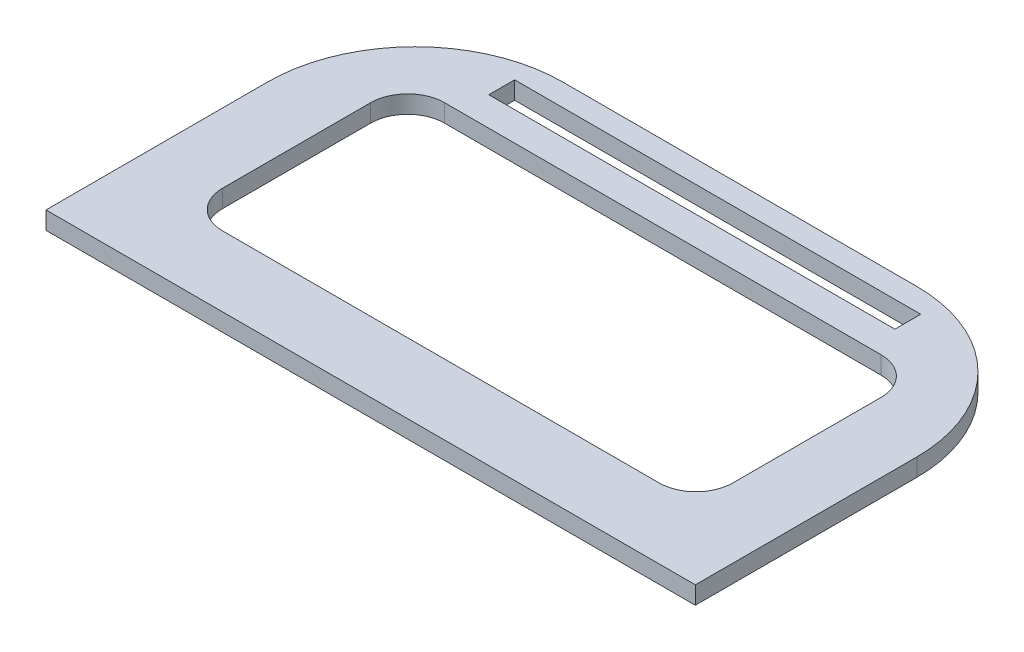
ISO-10303-21;
HEADER;
FILE_DESCRIPTION(('STEP AP214'),'2;1');
FILE_NAME('part.step','',(''),(''),'','','');
FILE_SCHEMA(('AUTOMOTIVE_DESIGN { 1 0 10303 214 1 1 1 1 }'));
ENDSEC;
DATA;
#1=APPLICATION_CONTEXT('core data for automotive mechanical design processes');
#2=APPLICATION_PROTOCOL_DEFINITION('international standard','automotive_design',2000,#1);
#3=PRODUCT_CONTEXT('',#1,'mechanical');
#4=PRODUCT('Part','Part','',(#3));
#5=PRODUCT_RELATED_PRODUCT_CATEGORY('part','',(#4));
#6=PRODUCT_DEFINITION_FORMATION('','',#4);
#7=PRODUCT_DEFINITION_CONTEXT('part definition',#1,'design');
#8=PRODUCT_DEFINITION('design','',#6,#7);
#9=PRODUCT_DEFINITION_SHAPE('','',#8);
#10=(LENGTH_UNIT() NAMED_UNIT(*) SI_UNIT(.MILLI.,.METRE.));
#11=(NAMED_UNIT(*) PLANE_ANGLE_UNIT() SI_UNIT($,.RADIAN.));
#12=(NAMED_UNIT(*) SI_UNIT($,.STERADIAN.) SOLID_ANGLE_UNIT());
#13=UNCERTAINTY_MEASURE_WITH_UNIT(LENGTH_MEASURE(1.E-05),#10,'distance_accuracy_value','');
#14=(GEOMETRIC_REPRESENTATION_CONTEXT(3) GLOBAL_UNCERTAINTY_ASSIGNED_CONTEXT((#13)) GLOBAL_UNIT_ASSIGNED_CONTEXT((#10,
#11,#12)) REPRESENTATION_CONTEXT('',''));
#15=CARTESIAN_POINT('',(0.,0.,0.));
#16=DIRECTION('',(0.,0.,1.));
#17=DIRECTION('',(1.,0.,0.));
#18=AXIS2_PLACEMENT_3D('',#15,#16,#17);
#19=CARTESIAN_POINT('',(0.,0.24,0.));
#20=DIRECTION('',(0.,-1.,0.));
#21=DIRECTION('',(0.,0.,-1.));
#22=AXIS2_PLACEMENT_3D('',#19,#20,#21);
#23=PLANE('',#22);
#24=DIRECTION('',(1.,0.,0.));
#25=VECTOR('',#24,1.);
#26=CARTESIAN_POINT('',(0.940876916961848,0.24,-0.949696404322964));
#27=LINE('',#26,#25);
#28=CARTESIAN_POINT('',(1.44087691696185,0.24,-0.949696404322964));
#29=VERTEX_POINT('',#28);
#30=CARTESIAN_POINT('',(7.35420939937131,0.24,-0.949696404322964));
#31=VERTEX_POINT('',#30);
#32=EDGE_CURVE('E372',#29,#31,#27,.T.);
#33=ORIENTED_EDGE('',*,*,#32,.F.);
#34=CARTESIAN_POINT('',(1.44087691696185,0.24,-1.44969640432296));
#35=DIRECTION('',(0.,-1.,0.));
#36=DIRECTION('',(0.,0.,-1.));
#37=AXIS2_PLACEMENT_3D('',#34,#35,#36);
#38=CIRCLE('',#37,0.5);
#39=CARTESIAN_POINT('',(0.940876916961848,0.24,-1.44969640432296));
#40=VERTEX_POINT('',#39);
#41=EDGE_CURVE('E49',#29,#40,#38,.T.);
#42=ORIENTED_EDGE('',*,*,#41,.T.);
#43=DIRECTION('',(0.,0.,1.));
#44=VECTOR('',#43,1.);
#45=CARTESIAN_POINT('',(0.940876916961848,0.24,-3.95690426450912));
#46=LINE('',#45,#44);
#47=CARTESIAN_POINT('',(0.940876916961848,0.24,-3.45690426450912));
#48=VERTEX_POINT('',#47);
#49=EDGE_CURVE('E370',#48,#40,#46,.T.);
#50=ORIENTED_EDGE('',*,*,#49,.F.);
#51=CARTESIAN_POINT('',(1.44087691696185,0.24,-3.45690426450912));
#52=DIRECTION('',(0.,-1.,0.));
#53=DIRECTION('',(0.,0.,-1.));
#54=AXIS2_PLACEMENT_3D('',#51,#52,#53);
#55=CIRCLE('',#54,0.5);
#56=CARTESIAN_POINT('',(1.44087691696185,0.24,-3.95690426450912));
#57=VERTEX_POINT('',#56);
#58=EDGE_CURVE('E361',#48,#57,#55,.T.);
#59=ORIENTED_EDGE('',*,*,#58,.T.);
#60=DIRECTION('',(-1.,0.,0.));
#61=VECTOR('',#60,1.);
#62=CARTESIAN_POINT('',(0.940876916961848,0.24,-3.95690426450912));
#63=LINE('',#62,#61);
#64=CARTESIAN_POINT('',(7.35420939937131,0.24,-3.95690426450912));
#65=VERTEX_POINT('',#64);
#66=EDGE_CURVE('E398',#65,#57,#63,.T.);
#67=ORIENTED_EDGE('',*,*,#66,.F.);
#68=CARTESIAN_POINT('',(7.35420939937131,0.24,-3.45690426450912));
#69=DIRECTION('',(0.,-1.,0.));
#70=DIRECTION('',(0.,0.,-1.));
#71=AXIS2_PLACEMENT_3D('',#68,#69,#70);
#72=CIRCLE('',#71,0.5);
#73=CARTESIAN_POINT('',(7.85420939937131,0.24,-3.45690426450912));
#74=VERTEX_POINT('',#73);
#75=EDGE_CURVE('E355',#65,#74,#72,.T.);
#76=ORIENTED_EDGE('',*,*,#75,.T.);
#77=DIRECTION('',(0.,0.,-1.));
#78=VECTOR('',#77,1.);
#79=CARTESIAN_POINT('',(7.85420939937131,0.24,-3.95690426450912));
#80=LINE('',#79,#78);
#81=CARTESIAN_POINT('',(7.85420939937131,0.24,-1.44969640432296));
#82=VERTEX_POINT('',#81);
#83=EDGE_CURVE('E404',#82,#74,#80,.T.);
#84=ORIENTED_EDGE('',*,*,#83,.F.);
#85=CARTESIAN_POINT('',(7.35420939937131,0.24,-1.44969640432296));
#86=DIRECTION('',(0.,-1.,0.));
#87=DIRECTION('',(0.,0.,-1.));
#88=AXIS2_PLACEMENT_3D('',#85,#86,#87);
#89=CIRCLE('',#88,0.5);
#90=EDGE_CURVE('E349',#82,#31,#89,.T.);
#91=ORIENTED_EDGE('',*,*,#90,.T.);
#92=EDGE_LOOP('',(#33,#42,#50,#59,#67,#76,#84,#91));
#93=FACE_BOUND('',#92,.T.);
#94=DIRECTION('',(0.,0.,-1.));
#95=VECTOR('',#94,1.);
#96=CARTESIAN_POINT('',(8.79508631633316,0.24,-5.));
#97=LINE('',#96,#95);
#98=CARTESIAN_POINT('',(8.79508631633316,0.24,0.));
#99=VERTEX_POINT('',#98);
#100=CARTESIAN_POINT('',(8.79508631633316,0.24,-3.));
#101=VERTEX_POINT('',#100);
#102=EDGE_CURVE('E264',#99,#101,#97,.T.);
#103=ORIENTED_EDGE('',*,*,#102,.T.);
#104=CARTESIAN_POINT('',(6.79508631633316,0.24,-3.));
#105=DIRECTION('',(0.,-1.,0.));
#106=DIRECTION('',(0.,0.,-1.));
#107=AXIS2_PLACEMENT_3D('',#104,#105,#106);
#108=CIRCLE('',#107,2.);
#109=CARTESIAN_POINT('',(6.79508631633316,0.24,-5.));
#110=VERTEX_POINT('',#109);
#111=EDGE_CURVE('E316',#101,#110,#108,.F.);
#112=ORIENTED_EDGE('',*,*,#111,.T.);
#113=DIRECTION('',(-1.,0.,0.));
#114=VECTOR('',#113,1.);
#115=CARTESIAN_POINT('',(0.,0.24,-5.));
#116=LINE('',#115,#114);
#117=CARTESIAN_POINT('',(2.,0.24,-5.));
#118=VERTEX_POINT('',#117);
#119=EDGE_CURVE('E269',#110,#118,#116,.T.);
#120=ORIENTED_EDGE('',*,*,#119,.T.);
#121=CARTESIAN_POINT('',(2.,0.24,-3.));
#122=DIRECTION('',(0.,-1.,0.));
#123=DIRECTION('',(0.,0.,-1.));
#124=AXIS2_PLACEMENT_3D('',#121,#122,#123);
#125=CIRCLE('',#124,2.);
#126=CARTESIAN_POINT('',(0.,0.24,-3.));
#127=VERTEX_POINT('',#126);
#128=EDGE_CURVE('E313',#118,#127,#125,.F.);
#129=ORIENTED_EDGE('',*,*,#128,.T.);
#130=DIRECTION('',(0.,0.,1.));
#131=VECTOR('',#130,1.);
#132=CARTESIAN_POINT('',(0.,0.24,0.));
#133=LINE('',#132,#131);
#134=CARTESIAN_POINT('',(0.,0.24,0.));
#135=VERTEX_POINT('',#134);
#136=EDGE_CURVE('E273',#127,#135,#133,.T.);
#137=ORIENTED_EDGE('',*,*,#136,.T.);
#138=DIRECTION('',(1.,0.,0.));
#139=VECTOR('',#138,1.);
#140=CARTESIAN_POINT('',(8.79508631633316,0.24,0.));
#141=LINE('',#140,#139);
#142=EDGE_CURVE('E260',#135,#99,#141,.T.);
#143=ORIENTED_EDGE('',*,*,#142,.T.);
#144=EDGE_LOOP('',(#103,#112,#120,#129,#137,#143));
#145=FACE_BOUND('',#144,.T.);
#146=DIRECTION('',(-1.,0.,0.));
#147=VECTOR('',#146,1.);
#148=CARTESIAN_POINT('',(7.14754315816658,0.24,-4.7));
#149=LINE('',#148,#147);
#150=CARTESIAN_POINT('',(7.14754315816658,0.24,-4.7));
#151=VERTEX_POINT('',#150);
#152=CARTESIAN_POINT('',(1.64754315816658,0.24,-4.7));
#153=VERTEX_POINT('',#152);
#154=EDGE_CURVE('E204',#151,#153,#149,.T.);
#155=ORIENTED_EDGE('',*,*,#154,.F.);
#156=DIRECTION('',(0.,0.,-1.));
#157=VECTOR('',#156,1.);
#158=CARTESIAN_POINT('',(7.14754315816658,0.24,-4.35));
#159=LINE('',#158,#157);
#160=CARTESIAN_POINT('',(7.14754315816658,0.24,-4.35));
#161=VERTEX_POINT('',#160);
#162=EDGE_CURVE('E235',#161,#151,#159,.T.);
#163=ORIENTED_EDGE('',*,*,#162,.F.);
#164=DIRECTION('',(1.,0.,0.));
#165=VECTOR('',#164,1.);
#166=CARTESIAN_POINT('',(1.64754315816658,0.24,-4.35));
#167=LINE('',#166,#165);
#168=CARTESIAN_POINT('',(1.64754315816658,0.24,-4.35));
#169=VERTEX_POINT('',#168);
#170=EDGE_CURVE('E229',#169,#161,#167,.T.);
#171=ORIENTED_EDGE('',*,*,#170,.F.);
#172=DIRECTION('',(0.,0.,1.));
#173=VECTOR('',#172,1.);
#174=CARTESIAN_POINT('',(1.64754315816658,0.24,-4.7));
#175=LINE('',#174,#173);
#176=EDGE_CURVE('E215',#153,#169,#175,.T.);
#177=ORIENTED_EDGE('',*,*,#176,.F.);
#178=EDGE_LOOP('',(#155,#163,#171,#177));
#179=FACE_BOUND('',#178,.T.);
#180=ADVANCED_FACE('F40',(#93,#145,#179),#23,.F.);
#181=CARTESIAN_POINT('',(0.,0.,0.));
#182=DIRECTION('',(0.,-1.,0.));
#183=DIRECTION('',(0.,0.,-1.));
#184=AXIS2_PLACEMENT_3D('',#181,#182,#183);
#185=PLANE('',#184);
#186=DIRECTION('',(-1.,0.,0.));
#187=VECTOR('',#186,1.);
#188=CARTESIAN_POINT('',(0.940876916961848,0.,-3.95690426450912));
#189=LINE('',#188,#187);
#190=CARTESIAN_POINT('',(7.35420939937131,0.,-3.95690426450912));
#191=VERTEX_POINT('',#190);
#192=CARTESIAN_POINT('',(1.44087691696185,0.,-3.95690426450912));
#193=VERTEX_POINT('',#192);
#194=EDGE_CURVE('E244',#191,#193,#189,.T.);
#195=ORIENTED_EDGE('',*,*,#194,.T.);
#196=CARTESIAN_POINT('',(1.44087691696185,0.,-3.45690426450912));
#197=DIRECTION('',(0.,-1.,0.));
#198=DIRECTION('',(0.,0.,-1.));
#199=AXIS2_PLACEMENT_3D('',#196,#197,#198);
#200=CIRCLE('',#199,0.5);
#201=CARTESIAN_POINT('',(0.940876916961848,0.,-3.45690426450912));
#202=VERTEX_POINT('',#201);
#203=EDGE_CURVE('E69',#193,#202,#200,.F.);
#204=ORIENTED_EDGE('',*,*,#203,.T.);
#205=DIRECTION('',(0.,0.,1.));
#206=VECTOR('',#205,1.);
#207=CARTESIAN_POINT('',(0.940876916961848,0.,-3.95690426450912));
#208=LINE('',#207,#206);
#209=CARTESIAN_POINT('',(0.940876916961848,0.,-1.44969640432296));
#210=VERTEX_POINT('',#209);
#211=EDGE_CURVE('E386',#202,#210,#208,.T.);
#212=ORIENTED_EDGE('',*,*,#211,.T.);
#213=CARTESIAN_POINT('',(1.44087691696185,0.,-1.44969640432296));
#214=DIRECTION('',(0.,-1.,0.));
#215=DIRECTION('',(0.,0.,-1.));
#216=AXIS2_PLACEMENT_3D('',#213,#214,#215);
#217=CIRCLE('',#216,0.5);
#218=CARTESIAN_POINT('',(1.44087691696185,0.,-0.949696404322964));
#219=VERTEX_POINT('',#218);
#220=EDGE_CURVE('E11',#210,#219,#217,.F.);
#221=ORIENTED_EDGE('',*,*,#220,.T.);
#222=DIRECTION('',(1.,0.,0.));
#223=VECTOR('',#222,1.);
#224=CARTESIAN_POINT('',(0.940876916961848,0.,-0.949696404322964));
#225=LINE('',#224,#223);
#226=CARTESIAN_POINT('',(7.35420939937131,0.,-0.949696404322964));
#227=VERTEX_POINT('',#226);
#228=EDGE_CURVE('E384',#219,#227,#225,.T.);
#229=ORIENTED_EDGE('',*,*,#228,.T.);
#230=CARTESIAN_POINT('',(7.35420939937131,0.,-1.44969640432296));
#231=DIRECTION('',(0.,-1.,0.));
#232=DIRECTION('',(0.,0.,-1.));
#233=AXIS2_PLACEMENT_3D('',#230,#231,#232);
#234=CIRCLE('',#233,0.5);
#235=CARTESIAN_POINT('',(7.85420939937131,0.,-1.44969640432296));
#236=VERTEX_POINT('',#235);
#237=EDGE_CURVE('E352',#227,#236,#234,.F.);
#238=ORIENTED_EDGE('',*,*,#237,.T.);
#239=DIRECTION('',(0.,0.,-1.));
#240=VECTOR('',#239,1.);
#241=CARTESIAN_POINT('',(7.85420939937131,0.,-3.95690426450912));
#242=LINE('',#241,#240);
#243=CARTESIAN_POINT('',(7.85420939937131,0.,-3.45690426450912));
#244=VERTEX_POINT('',#243);
#245=EDGE_CURVE('E391',#236,#244,#242,.T.);
#246=ORIENTED_EDGE('',*,*,#245,.T.);
#247=CARTESIAN_POINT('',(7.35420939937131,0.,-3.45690426450912));
#248=DIRECTION('',(0.,-1.,0.));
#249=DIRECTION('',(0.,0.,-1.));
#250=AXIS2_PLACEMENT_3D('',#247,#248,#249);
#251=CIRCLE('',#250,0.5);
#252=EDGE_CURVE('E358',#244,#191,#251,.F.);
#253=ORIENTED_EDGE('',*,*,#252,.T.);
#254=EDGE_LOOP('',(#195,#204,#212,#221,#229,#238,#246,#253));
#255=FACE_BOUND('',#254,.T.);
#256=DIRECTION('',(-1.,0.,0.));
#257=VECTOR('',#256,1.);
#258=CARTESIAN_POINT('',(0.,0.,-5.));
#259=LINE('',#258,#257);
#260=CARTESIAN_POINT('',(6.79508631633316,0.,-5.));
#261=VERTEX_POINT('',#260);
#262=CARTESIAN_POINT('',(2.,0.,-5.));
#263=VERTEX_POINT('',#262);
#264=EDGE_CURVE('E284',#261,#263,#259,.T.);
#265=ORIENTED_EDGE('',*,*,#264,.F.);
#266=CARTESIAN_POINT('',(6.79508631633316,0.,-3.));
#267=DIRECTION('',(0.,-1.,0.));
#268=DIRECTION('',(0.,0.,-1.));
#269=AXIS2_PLACEMENT_3D('',#266,#267,#268);
#270=CIRCLE('',#269,2.);
#271=CARTESIAN_POINT('',(8.79508631633316,0.,-3.));
#272=VERTEX_POINT('',#271);
#273=EDGE_CURVE('E307',#261,#272,#270,.T.);
#274=ORIENTED_EDGE('',*,*,#273,.T.);
#275=DIRECTION('',(0.,0.,-1.));
#276=VECTOR('',#275,1.);
#277=CARTESIAN_POINT('',(8.79508631633316,0.,-5.));
#278=LINE('',#277,#276);
#279=CARTESIAN_POINT('',(8.79508631633316,0.,0.));
#280=VERTEX_POINT('',#279);
#281=EDGE_CURVE('E280',#280,#272,#278,.T.);
#282=ORIENTED_EDGE('',*,*,#281,.F.);
#283=DIRECTION('',(1.,0.,0.));
#284=VECTOR('',#283,1.);
#285=CARTESIAN_POINT('',(8.79508631633316,0.,0.));
#286=LINE('',#285,#284);
#287=CARTESIAN_POINT('',(0.,0.,0.));
#288=VERTEX_POINT('',#287);
#289=EDGE_CURVE('E224',#288,#280,#286,.T.);
#290=ORIENTED_EDGE('',*,*,#289,.F.);
#291=DIRECTION('',(0.,0.,1.));
#292=VECTOR('',#291,1.);
#293=CARTESIAN_POINT('',(0.,0.,0.));
#294=LINE('',#293,#292);
#295=CARTESIAN_POINT('',(0.,0.,-3.));
#296=VERTEX_POINT('',#295);
#297=EDGE_CURVE('E265',#296,#288,#294,.T.);
#298=ORIENTED_EDGE('',*,*,#297,.F.);
#299=CARTESIAN_POINT('',(2.,0.,-3.));
#300=DIRECTION('',(0.,-1.,0.));
#301=DIRECTION('',(0.,0.,-1.));
#302=AXIS2_PLACEMENT_3D('',#299,#300,#301);
#303=CIRCLE('',#302,2.);
#304=EDGE_CURVE('E304',#296,#263,#303,.T.);
#305=ORIENTED_EDGE('',*,*,#304,.T.);
#306=EDGE_LOOP('',(#265,#274,#282,#290,#298,#305));
#307=FACE_BOUND('',#306,.T.);
#308=DIRECTION('',(0.,0.,-1.));
#309=VECTOR('',#308,1.);
#310=CARTESIAN_POINT('',(7.14754315816658,0.,-4.35));
#311=LINE('',#310,#309);
#312=CARTESIAN_POINT('',(7.14754315816658,0.,-4.35));
#313=VERTEX_POINT('',#312);
#314=CARTESIAN_POINT('',(7.14754315816658,0.,-4.7));
#315=VERTEX_POINT('',#314);
#316=EDGE_CURVE('E216',#313,#315,#311,.T.);
#317=ORIENTED_EDGE('',*,*,#316,.T.);
#318=DIRECTION('',(-1.,0.,0.));
#319=VECTOR('',#318,1.);
#320=CARTESIAN_POINT('',(7.14754315816658,0.,-4.7));
#321=LINE('',#320,#319);
#322=CARTESIAN_POINT('',(1.64754315816658,0.,-4.7));
#323=VERTEX_POINT('',#322);
#324=EDGE_CURVE('E241',#315,#323,#321,.T.);
#325=ORIENTED_EDGE('',*,*,#324,.T.);
#326=DIRECTION('',(0.,0.,1.));
#327=VECTOR('',#326,1.);
#328=CARTESIAN_POINT('',(1.64754315816658,0.,-4.7));
#329=LINE('',#328,#327);
#330=CARTESIAN_POINT('',(1.64754315816658,0.,-4.35));
#331=VERTEX_POINT('',#330);
#332=EDGE_CURVE('E222',#323,#331,#329,.T.);
#333=ORIENTED_EDGE('',*,*,#332,.T.);
#334=DIRECTION('',(1.,0.,0.));
#335=VECTOR('',#334,1.);
#336=CARTESIAN_POINT('',(1.64754315816658,0.,-4.35));
#337=LINE('',#336,#335);
#338=EDGE_CURVE('E246',#331,#313,#337,.T.);
#339=ORIENTED_EDGE('',*,*,#338,.T.);
#340=EDGE_LOOP('',(#317,#325,#333,#339));
#341=FACE_BOUND('',#340,.T.);
#342=ADVANCED_FACE('F382',(#255,#307,#341),#185,.T.);
#343=CARTESIAN_POINT('',(8.79508631633316,0.24,0.));
#344=DIRECTION('',(0.,0.,-1.));
#345=DIRECTION('',(-1.,0.,0.));
#346=AXIS2_PLACEMENT_3D('',#343,#344,#345);
#347=PLANE('',#346);
#348=ORIENTED_EDGE('',*,*,#289,.T.);
#349=DIRECTION('',(0.,-1.,0.));
#350=VECTOR('',#349,1.);
#351=CARTESIAN_POINT('',(8.79508631633316,0.24,0.));
#352=LINE('',#351,#350);
#353=EDGE_CURVE('E293',#99,#280,#352,.T.);
#354=ORIENTED_EDGE('',*,*,#353,.F.);
#355=ORIENTED_EDGE('',*,*,#142,.F.);
#356=DIRECTION('',(0.,-1.,0.));
#357=VECTOR('',#356,1.);
#358=CARTESIAN_POINT('',(0.,0.24,0.));
#359=LINE('',#358,#357);
#360=EDGE_CURVE('E276',#135,#288,#359,.T.);
#361=ORIENTED_EDGE('',*,*,#360,.T.);
#362=EDGE_LOOP('',(#348,#354,#355,#361));
#363=FACE_BOUND('',#362,.T.);
#364=ADVANCED_FACE('F431',(#363),#347,.F.);
#365=CARTESIAN_POINT('',(8.79508631633316,0.24,-5.));
#366=DIRECTION('',(-1.,0.,0.));
#367=DIRECTION('',(0.,0.,1.));
#368=AXIS2_PLACEMENT_3D('',#365,#366,#367);
#369=PLANE('',#368);
#370=ORIENTED_EDGE('',*,*,#281,.T.);
#371=DIRECTION('',(0.,-1.,0.));
#372=VECTOR('',#371,1.);
#373=CARTESIAN_POINT('',(8.79508631633316,0.24,-3.));
#374=LINE('',#373,#372);
#375=EDGE_CURVE('E310',#272,#101,#374,.F.);
#376=ORIENTED_EDGE('',*,*,#375,.T.);
#377=ORIENTED_EDGE('',*,*,#102,.F.);
#378=ORIENTED_EDGE('',*,*,#353,.T.);
#379=EDGE_LOOP('',(#370,#376,#377,#378));
#380=FACE_BOUND('',#379,.T.);
#381=ADVANCED_FACE('F443',(#380),#369,.F.);
#382=CARTESIAN_POINT('',(0.,0.24,-5.));
#383=DIRECTION('',(0.,0.,1.));
#384=DIRECTION('',(1.,0.,0.));
#385=AXIS2_PLACEMENT_3D('',#382,#383,#384);
#386=PLANE('',#385);
#387=ORIENTED_EDGE('',*,*,#119,.F.);
#388=DIRECTION('',(0.,-1.,0.));
#389=VECTOR('',#388,1.);
#390=CARTESIAN_POINT('',(6.79508631633316,0.24,-5.));
#391=LINE('',#390,#389);
#392=EDGE_CURVE('E300',#110,#261,#391,.T.);
#393=ORIENTED_EDGE('',*,*,#392,.T.);
#394=ORIENTED_EDGE('',*,*,#264,.T.);
#395=DIRECTION('',(0.,-1.,0.));
#396=VECTOR('',#395,1.);
#397=CARTESIAN_POINT('',(2.,0.24,-5.));
#398=LINE('',#397,#396);
#399=EDGE_CURVE('E297',#263,#118,#398,.F.);
#400=ORIENTED_EDGE('',*,*,#399,.T.);
#401=EDGE_LOOP('',(#387,#393,#394,#400));
#402=FACE_BOUND('',#401,.T.);
#403=ADVANCED_FACE('F439',(#402),#386,.F.);
#404=CARTESIAN_POINT('',(0.,0.24,0.));
#405=DIRECTION('',(1.,0.,0.));
#406=DIRECTION('',(0.,0.,-1.));
#407=AXIS2_PLACEMENT_3D('',#404,#405,#406);
#408=PLANE('',#407);
#409=ORIENTED_EDGE('',*,*,#136,.F.);
#410=DIRECTION('',(0.,-1.,0.));
#411=VECTOR('',#410,1.);
#412=CARTESIAN_POINT('',(0.,0.24,-3.));
#413=LINE('',#412,#411);
#414=EDGE_CURVE('E319',#127,#296,#413,.T.);
#415=ORIENTED_EDGE('',*,*,#414,.T.);
#416=ORIENTED_EDGE('',*,*,#297,.T.);
#417=ORIENTED_EDGE('',*,*,#360,.F.);
#418=EDGE_LOOP('',(#409,#415,#416,#417));
#419=FACE_BOUND('',#418,.T.);
#420=ADVANCED_FACE('F436',(#419),#408,.F.);
#421=CARTESIAN_POINT('',(7.14754315816658,0.24,-4.7));
#422=DIRECTION('',(0.,0.,1.));
#423=DIRECTION('',(1.,0.,0.));
#424=AXIS2_PLACEMENT_3D('',#421,#422,#423);
#425=PLANE('',#424);
#426=ORIENTED_EDGE('',*,*,#324,.F.);
#427=DIRECTION('',(0.,-1.,0.));
#428=VECTOR('',#427,1.);
#429=CARTESIAN_POINT('',(7.14754315816658,0.24,-4.7));
#430=LINE('',#429,#428);
#431=EDGE_CURVE('E210',#151,#315,#430,.T.);
#432=ORIENTED_EDGE('',*,*,#431,.F.);
#433=ORIENTED_EDGE('',*,*,#154,.T.);
#434=DIRECTION('',(0.,-1.,0.));
#435=VECTOR('',#434,1.);
#436=CARTESIAN_POINT('',(1.64754315816658,0.24,-4.7));
#437=LINE('',#436,#435);
#438=EDGE_CURVE('E207',#153,#323,#437,.T.);
#439=ORIENTED_EDGE('',*,*,#438,.T.);
#440=EDGE_LOOP('',(#426,#432,#433,#439));
#441=FACE_BOUND('',#440,.T.);
#442=ADVANCED_FACE('F206',(#441),#425,.T.);
#443=CARTESIAN_POINT('',(1.64754315816658,0.24,-4.7));
#444=DIRECTION('',(1.,0.,0.));
#445=DIRECTION('',(0.,0.,-1.));
#446=AXIS2_PLACEMENT_3D('',#443,#444,#445);
#447=PLANE('',#446);
#448=ORIENTED_EDGE('',*,*,#332,.F.);
#449=ORIENTED_EDGE('',*,*,#438,.F.);
#450=ORIENTED_EDGE('',*,*,#176,.T.);
#451=DIRECTION('',(0.,-1.,0.));
#452=VECTOR('',#451,1.);
#453=CARTESIAN_POINT('',(1.64754315816658,0.24,-4.35));
#454=LINE('',#453,#452);
#455=EDGE_CURVE('E225',#169,#331,#454,.T.);
#456=ORIENTED_EDGE('',*,*,#455,.T.);
#457=EDGE_LOOP('',(#448,#449,#450,#456));
#458=FACE_BOUND('',#457,.T.);
#459=ADVANCED_FACE('F219',(#458),#447,.T.);
#460=CARTESIAN_POINT('',(1.64754315816658,0.24,-4.35));
#461=DIRECTION('',(0.,0.,-1.));
#462=DIRECTION('',(-1.,0.,0.));
#463=AXIS2_PLACEMENT_3D('',#460,#461,#462);
#464=PLANE('',#463);
#465=ORIENTED_EDGE('',*,*,#338,.F.);
#466=ORIENTED_EDGE('',*,*,#455,.F.);
#467=ORIENTED_EDGE('',*,*,#170,.T.);
#468=DIRECTION('',(0.,-1.,0.));
#469=VECTOR('',#468,1.);
#470=CARTESIAN_POINT('',(7.14754315816658,0.24,-4.35));
#471=LINE('',#470,#469);
#472=EDGE_CURVE('E255',#161,#313,#471,.T.);
#473=ORIENTED_EDGE('',*,*,#472,.T.);
#474=EDGE_LOOP('',(#465,#466,#467,#473));
#475=FACE_BOUND('',#474,.T.);
#476=ADVANCED_FACE('F484',(#475),#464,.T.);
#477=CARTESIAN_POINT('',(7.14754315816658,0.24,-4.35));
#478=DIRECTION('',(-1.,0.,0.));
#479=DIRECTION('',(0.,0.,1.));
#480=AXIS2_PLACEMENT_3D('',#477,#478,#479);
#481=PLANE('',#480);
#482=ORIENTED_EDGE('',*,*,#316,.F.);
#483=ORIENTED_EDGE('',*,*,#472,.F.);
#484=ORIENTED_EDGE('',*,*,#162,.T.);
#485=ORIENTED_EDGE('',*,*,#431,.T.);
#486=EDGE_LOOP('',(#482,#483,#484,#485));
#487=FACE_BOUND('',#486,.T.);
#488=ADVANCED_FACE('F455',(#487),#481,.T.);
#489=CARTESIAN_POINT('',(6.79508631633316,0.24,-3.));
#490=DIRECTION('',(0.,-1.,0.));
#491=DIRECTION('',(0.,0.,-1.));
#492=AXIS2_PLACEMENT_3D('',#489,#490,#491);
#493=CYLINDRICAL_SURFACE('',#492,2.);
#494=ORIENTED_EDGE('',*,*,#111,.F.);
#495=ORIENTED_EDGE('',*,*,#375,.F.);
#496=ORIENTED_EDGE('',*,*,#273,.F.);
#497=ORIENTED_EDGE('',*,*,#392,.F.);
#498=EDGE_LOOP('',(#494,#495,#496,#497));
#499=FACE_BOUND('',#498,.T.);
#500=ADVANCED_FACE('F451',(#499),#493,.T.);
#501=CARTESIAN_POINT('',(2.,0.24,-3.));
#502=DIRECTION('',(0.,-1.,0.));
#503=DIRECTION('',(0.,0.,-1.));
#504=AXIS2_PLACEMENT_3D('',#501,#502,#503);
#505=CYLINDRICAL_SURFACE('',#504,2.);
#506=ORIENTED_EDGE('',*,*,#128,.F.);
#507=ORIENTED_EDGE('',*,*,#399,.F.);
#508=ORIENTED_EDGE('',*,*,#304,.F.);
#509=ORIENTED_EDGE('',*,*,#414,.F.);
#510=EDGE_LOOP('',(#506,#507,#508,#509));
#511=FACE_BOUND('',#510,.T.);
#512=ADVANCED_FACE('F454',(#511),#505,.T.);
#513=CARTESIAN_POINT('',(0.940876916961848,0.,-3.95690426450912));
#514=DIRECTION('',(-1.,0.,0.));
#515=DIRECTION('',(0.,0.,1.));
#516=AXIS2_PLACEMENT_3D('',#513,#514,#515);
#517=PLANE('',#516);
#518=ORIENTED_EDGE('',*,*,#211,.F.);
#519=DIRECTION('',(0.,1.,0.));
#520=VECTOR('',#519,1.);
#521=CARTESIAN_POINT('',(0.940876916961848,0.24,-3.45690426450912));
#522=LINE('',#521,#520);
#523=EDGE_CURVE('E345',#202,#48,#522,.T.);
#524=ORIENTED_EDGE('',*,*,#523,.T.);
#525=ORIENTED_EDGE('',*,*,#49,.T.);
#526=DIRECTION('',(0.,1.,0.));
#527=VECTOR('',#526,1.);
#528=CARTESIAN_POINT('',(0.940876916961848,0.,-1.44969640432296));
#529=LINE('',#528,#527);
#530=EDGE_CURVE('E59',#40,#210,#529,.F.);
#531=ORIENTED_EDGE('',*,*,#530,.T.);
#532=EDGE_LOOP('',(#518,#524,#525,#531));
#533=FACE_BOUND('',#532,.T.);
#534=ADVANCED_FACE('F375',(#533),#517,.F.);
#535=CARTESIAN_POINT('',(0.940876916961848,0.,-3.95690426450912));
#536=DIRECTION('',(0.,0.,-1.));
#537=DIRECTION('',(-1.,0.,0.));
#538=AXIS2_PLACEMENT_3D('',#535,#536,#537);
#539=PLANE('',#538);
#540=ORIENTED_EDGE('',*,*,#194,.F.);
#541=DIRECTION('',(0.,1.,0.));
#542=VECTOR('',#541,1.);
#543=CARTESIAN_POINT('',(7.35420939937131,0.24,-3.95690426450912));
#544=LINE('',#543,#542);
#545=EDGE_CURVE('E339',#191,#65,#544,.T.);
#546=ORIENTED_EDGE('',*,*,#545,.T.);
#547=ORIENTED_EDGE('',*,*,#66,.T.);
#548=DIRECTION('',(0.,1.,0.));
#549=VECTOR('',#548,1.);
#550=CARTESIAN_POINT('',(1.44087691696185,0.,-3.95690426450912));
#551=LINE('',#550,#549);
#552=EDGE_CURVE('E337',#57,#193,#551,.F.);
#553=ORIENTED_EDGE('',*,*,#552,.T.);
#554=EDGE_LOOP('',(#540,#546,#547,#553));
#555=FACE_BOUND('',#554,.T.);
#556=ADVANCED_FACE('F413',(#555),#539,.F.);
#557=CARTESIAN_POINT('',(7.85420939937131,0.,-3.95690426450912));
#558=DIRECTION('',(1.,0.,0.));
#559=DIRECTION('',(0.,0.,-1.));
#560=AXIS2_PLACEMENT_3D('',#557,#558,#559);
#561=PLANE('',#560);
#562=ORIENTED_EDGE('',*,*,#245,.F.);
#563=DIRECTION('',(0.,1.,0.));
#564=VECTOR('',#563,1.);
#565=CARTESIAN_POINT('',(7.85420939937131,0.24,-1.44969640432296));
#566=LINE('',#565,#564);
#567=EDGE_CURVE('E326',#236,#82,#566,.T.);
#568=ORIENTED_EDGE('',*,*,#567,.T.);
#569=ORIENTED_EDGE('',*,*,#83,.T.);
#570=DIRECTION('',(0.,1.,0.));
#571=VECTOR('',#570,1.);
#572=CARTESIAN_POINT('',(7.85420939937131,0.,-3.45690426450912));
#573=LINE('',#572,#571);
#574=EDGE_CURVE('E323',#74,#244,#573,.F.);
#575=ORIENTED_EDGE('',*,*,#574,.T.);
#576=EDGE_LOOP('',(#562,#568,#569,#575));
#577=FACE_BOUND('',#576,.T.);
#578=ADVANCED_FACE('F465',(#577),#561,.F.);
#579=CARTESIAN_POINT('',(0.940876916961848,0.,-0.949696404322964));
#580=DIRECTION('',(0.,0.,1.));
#581=DIRECTION('',(1.,0.,0.));
#582=AXIS2_PLACEMENT_3D('',#579,#580,#581);
#583=PLANE('',#582);
#584=ORIENTED_EDGE('',*,*,#32,.T.);
#585=DIRECTION('',(0.,1.,0.));
#586=VECTOR('',#585,1.);
#587=CARTESIAN_POINT('',(7.35420939937131,0.,-0.949696404322964));
#588=LINE('',#587,#586);
#589=EDGE_CURVE('E334',#31,#227,#588,.F.);
#590=ORIENTED_EDGE('',*,*,#589,.T.);
#591=ORIENTED_EDGE('',*,*,#228,.F.);
#592=DIRECTION('',(0.,1.,0.));
#593=VECTOR('',#592,1.);
#594=CARTESIAN_POINT('',(1.44087691696185,0.24,-0.949696404322964));
#595=LINE('',#594,#593);
#596=EDGE_CURVE('E330',#219,#29,#595,.T.);
#597=ORIENTED_EDGE('',*,*,#596,.T.);
#598=EDGE_LOOP('',(#584,#590,#591,#597));
#599=FACE_BOUND('',#598,.T.);
#600=ADVANCED_FACE('F388',(#599),#583,.F.);
#601=CARTESIAN_POINT('',(7.35420939937131,0.,-1.44969640432296));
#602=DIRECTION('',(0.,-1.,0.));
#603=DIRECTION('',(0.,0.,-1.));
#604=AXIS2_PLACEMENT_3D('',#601,#602,#603);
#605=CYLINDRICAL_SURFACE('',#604,0.5);
#606=ORIENTED_EDGE('',*,*,#237,.F.);
#607=ORIENTED_EDGE('',*,*,#589,.F.);
#608=ORIENTED_EDGE('',*,*,#90,.F.);
#609=ORIENTED_EDGE('',*,*,#567,.F.);
#610=EDGE_LOOP('',(#606,#607,#608,#609));
#611=FACE_BOUND('',#610,.T.);
#612=ADVANCED_FACE('F423',(#611),#605,.F.);
#613=CARTESIAN_POINT('',(7.35420939937131,0.,-3.45690426450912));
#614=DIRECTION('',(0.,-1.,0.));
#615=DIRECTION('',(0.,0.,-1.));
#616=AXIS2_PLACEMENT_3D('',#613,#614,#615);
#617=CYLINDRICAL_SURFACE('',#616,0.5);
#618=ORIENTED_EDGE('',*,*,#252,.F.);
#619=ORIENTED_EDGE('',*,*,#574,.F.);
#620=ORIENTED_EDGE('',*,*,#75,.F.);
#621=ORIENTED_EDGE('',*,*,#545,.F.);
#622=EDGE_LOOP('',(#618,#619,#620,#621));
#623=FACE_BOUND('',#622,.T.);
#624=ADVANCED_FACE('F418',(#623),#617,.F.);
#625=CARTESIAN_POINT('',(1.44087691696185,0.,-3.45690426450912));
#626=DIRECTION('',(0.,-1.,0.));
#627=DIRECTION('',(0.,0.,-1.));
#628=AXIS2_PLACEMENT_3D('',#625,#626,#627);
#629=CYLINDRICAL_SURFACE('',#628,0.5);
#630=ORIENTED_EDGE('',*,*,#203,.F.);
#631=ORIENTED_EDGE('',*,*,#552,.F.);
#632=ORIENTED_EDGE('',*,*,#58,.F.);
#633=ORIENTED_EDGE('',*,*,#523,.F.);
#634=EDGE_LOOP('',(#630,#631,#632,#633));
#635=FACE_BOUND('',#634,.T.);
#636=ADVANCED_FACE('F416',(#635),#629,.F.);
#637=CARTESIAN_POINT('',(1.44087691696185,0.,-1.44969640432296));
#638=DIRECTION('',(0.,-1.,0.));
#639=DIRECTION('',(0.,0.,-1.));
#640=AXIS2_PLACEMENT_3D('',#637,#638,#639);
#641=CYLINDRICAL_SURFACE('',#640,0.5);
#642=ORIENTED_EDGE('',*,*,#220,.F.);
#643=ORIENTED_EDGE('',*,*,#530,.F.);
#644=ORIENTED_EDGE('',*,*,#41,.F.);
#645=ORIENTED_EDGE('',*,*,#596,.F.);
#646=EDGE_LOOP('',(#642,#643,#644,#645));
#647=FACE_BOUND('',#646,.T.);
#648=ADVANCED_FACE('F42',(#647),#641,.F.);
#649=CLOSED_SHELL('',(#180,#342,#364,#381,#403,#420,#442,#459,#476,#488,#500,#512,#534,#556,
#578,#600,#612,#624,#636,#648));
#650=MANIFOLD_SOLID_BREP('B2',#649);
#651=ADVANCED_BREP_SHAPE_REPRESENTATION('',(#18,#650),#14);
#652=SHAPE_DEFINITION_REPRESENTATION(#9,#651);
ENDSEC;
END-ISO-10303-21;
